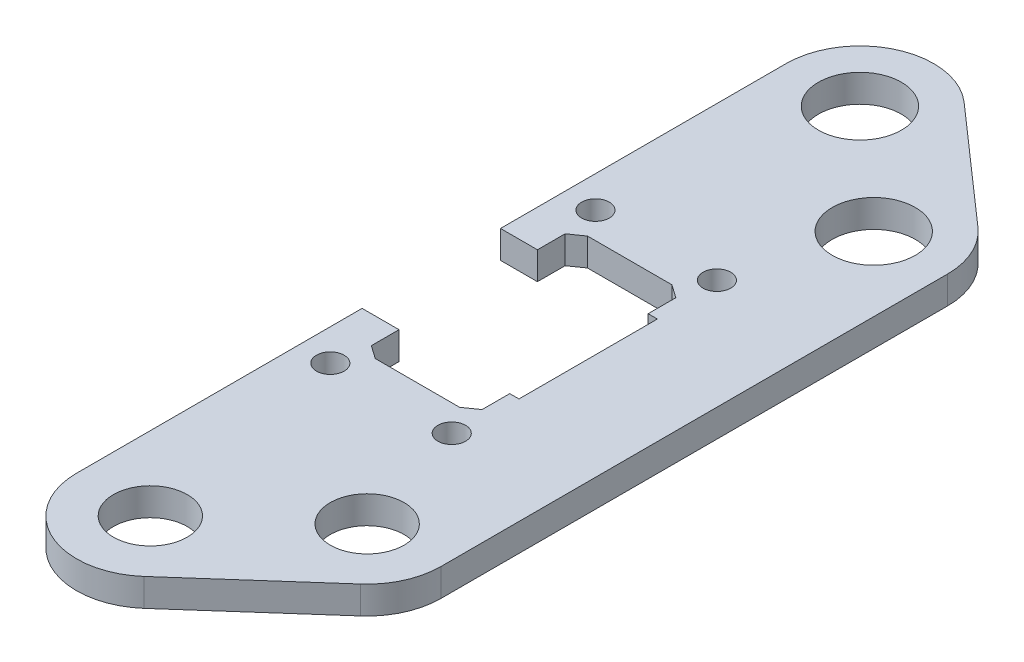
ISO-10303-21;
HEADER;
FILE_DESCRIPTION(('STEP AP214'),'2;1');
FILE_NAME('part.step','',(''),(''),'','','');
FILE_SCHEMA(('AUTOMOTIVE_DESIGN { 1 0 10303 214 1 1 1 1 }'));
ENDSEC;
DATA;
#1=APPLICATION_CONTEXT('core data for automotive mechanical design processes');
#2=APPLICATION_PROTOCOL_DEFINITION('international standard','automotive_design',2000,#1);
#3=PRODUCT_CONTEXT('',#1,'mechanical');
#4=PRODUCT('Part','Part','',(#3));
#5=PRODUCT_RELATED_PRODUCT_CATEGORY('part','',(#4));
#6=PRODUCT_DEFINITION_FORMATION('','',#4);
#7=PRODUCT_DEFINITION_CONTEXT('part definition',#1,'design');
#8=PRODUCT_DEFINITION('design','',#6,#7);
#9=PRODUCT_DEFINITION_SHAPE('','',#8);
#10=(LENGTH_UNIT() NAMED_UNIT(*) SI_UNIT(.MILLI.,.METRE.));
#11=(NAMED_UNIT(*) PLANE_ANGLE_UNIT() SI_UNIT($,.RADIAN.));
#12=(NAMED_UNIT(*) SI_UNIT($,.STERADIAN.) SOLID_ANGLE_UNIT());
#13=UNCERTAINTY_MEASURE_WITH_UNIT(LENGTH_MEASURE(1.E-05),#10,'distance_accuracy_value','');
#14=(GEOMETRIC_REPRESENTATION_CONTEXT(3) GLOBAL_UNCERTAINTY_ASSIGNED_CONTEXT((#13)) GLOBAL_UNIT_ASSIGNED_CONTEXT((#10,
#11,#12)) REPRESENTATION_CONTEXT('',''));
#15=CARTESIAN_POINT('',(0.,0.,0.));
#16=DIRECTION('',(0.,0.,1.));
#17=DIRECTION('',(1.,0.,0.));
#18=AXIS2_PLACEMENT_3D('',#15,#16,#17);
#19=CARTESIAN_POINT('',(-9.99999999999995,3.,0.));
#20=DIRECTION('',(-1.,0.,0.));
#21=DIRECTION('',(0.,0.,1.));
#22=AXIS2_PLACEMENT_3D('',#19,#20,#21);
#23=PLANE('',#22);
#24=DIRECTION('',(0.,0.,-1.));
#25=VECTOR('',#24,1.);
#26=CARTESIAN_POINT('',(-9.99999999999995,0.,0.));
#27=LINE('',#26,#25);
#28=CARTESIAN_POINT('',(-9.99999999999995,0.,38.4494228478842));
#29=VERTEX_POINT('',#28);
#30=CARTESIAN_POINT('',(-9.99999999999995,0.,7.49999999999991));
#31=VERTEX_POINT('',#30);
#32=EDGE_CURVE('E248',#29,#31,#27,.T.);
#33=ORIENTED_EDGE('',*,*,#32,.F.);
#34=DIRECTION('',(0.,-1.,0.));
#35=VECTOR('',#34,1.);
#36=CARTESIAN_POINT('',(-9.99999999999995,3.,38.4494228478842));
#37=LINE('',#36,#35);
#38=CARTESIAN_POINT('',(-9.99999999999995,3.,38.4494228478842));
#39=VERTEX_POINT('',#38);
#40=EDGE_CURVE('E11',#39,#29,#37,.T.);
#41=ORIENTED_EDGE('',*,*,#40,.F.);
#42=DIRECTION('',(0.,0.,-1.));
#43=VECTOR('',#42,1.);
#44=CARTESIAN_POINT('',(-9.99999999999995,3.,0.));
#45=LINE('',#44,#43);
#46=CARTESIAN_POINT('',(-9.99999999999995,3.,7.49999999999991));
#47=VERTEX_POINT('',#46);
#48=EDGE_CURVE('E380',#39,#47,#45,.T.);
#49=ORIENTED_EDGE('',*,*,#48,.T.);
#50=DIRECTION('',(0.,-1.,0.));
#51=VECTOR('',#50,1.);
#52=CARTESIAN_POINT('',(-9.99999999999995,3.,7.49999999999991));
#53=LINE('',#52,#51);
#54=EDGE_CURVE('E53',#47,#31,#53,.T.);
#55=ORIENTED_EDGE('',*,*,#54,.T.);
#56=EDGE_LOOP('',(#33,#41,#49,#55));
#57=FACE_BOUND('',#56,.T.);
#58=ADVANCED_FACE('F36',(#57),#23,.T.);
#59=CARTESIAN_POINT('',(-1.96890693060151,3.,38.4500022431788));
#60=DIRECTION('',(0.,-1.,0.));
#61=DIRECTION('',(0.,0.,-1.));
#62=AXIS2_PLACEMENT_3D('',#59,#60,#61);
#63=CYLINDRICAL_SURFACE('',#62,8.03109309033886);
#64=CARTESIAN_POINT('',(-1.96890693060151,0.,38.4500022431788));
#65=DIRECTION('',(0.,1.,0.));
#66=DIRECTION('',(0.,0.,1.));
#67=AXIS2_PLACEMENT_3D('',#64,#65,#66);
#68=CIRCLE('',#67,8.03109309033886);
#69=CARTESIAN_POINT('',(3.33665719137765,0.,44.4790523817915));
#70=VERTEX_POINT('',#69);
#71=EDGE_CURVE('E250',#29,#70,#68,.T.);
#72=ORIENTED_EDGE('',*,*,#71,.T.);
#73=DIRECTION('',(0.,-1.,0.));
#74=VECTOR('',#73,1.);
#75=CARTESIAN_POINT('',(3.33665719137765,3.,44.4790523817915));
#76=LINE('',#75,#74);
#77=CARTESIAN_POINT('',(3.33665719137765,3.,44.4790523817915));
#78=VERTEX_POINT('',#77);
#79=EDGE_CURVE('E45',#78,#70,#76,.T.);
#80=ORIENTED_EDGE('',*,*,#79,.F.);
#81=CARTESIAN_POINT('',(-1.96890693060151,3.,38.4500022431788));
#82=DIRECTION('',(0.,1.,0.));
#83=DIRECTION('',(0.,0.,1.));
#84=AXIS2_PLACEMENT_3D('',#81,#82,#83);
#85=CIRCLE('',#84,8.03109309033886);
#86=EDGE_CURVE('E378',#39,#78,#85,.T.);
#87=ORIENTED_EDGE('',*,*,#86,.F.);
#88=ORIENTED_EDGE('',*,*,#40,.T.);
#89=EDGE_LOOP('',(#72,#80,#87,#88));
#90=FACE_BOUND('',#89,.T.);
#91=ADVANCED_FACE('F365',(#90),#63,.T.);
#92=CARTESIAN_POINT('',(23.5426581772092,3.,26.5861974296433));
#93=DIRECTION('',(0.662954498755639,0.,0.748659690767213));
#94=DIRECTION('',(0.748659690767213,0.,-0.662954498755639));
#95=AXIS2_PLACEMENT_3D('',#92,#93,#94);
#96=PLANE('',#95);
#97=DIRECTION('',(-0.748659690767213,0.,0.662954498755639));
#98=VECTOR('',#97,1.);
#99=CARTESIAN_POINT('',(23.5426581772092,0.,26.5861974296433));
#100=LINE('',#99,#98);
#101=CARTESIAN_POINT('',(15.7967703221011,0.,33.4453502112471));
#102=VERTEX_POINT('',#101);
#103=EDGE_CURVE('E254',#102,#70,#100,.T.);
#104=ORIENTED_EDGE('',*,*,#103,.F.);
#105=DIRECTION('',(0.,-1.,0.));
#106=VECTOR('',#105,1.);
#107=CARTESIAN_POINT('',(15.7967703221011,3.,33.4453502112471));
#108=LINE('',#107,#106);
#109=CARTESIAN_POINT('',(15.7967703221011,3.,33.4453502112471));
#110=VERTEX_POINT('',#109);
#111=EDGE_CURVE('E355',#110,#102,#108,.T.);
#112=ORIENTED_EDGE('',*,*,#111,.F.);
#113=DIRECTION('',(-0.748659690767213,0.,0.662954498755639));
#114=VECTOR('',#113,1.);
#115=CARTESIAN_POINT('',(23.5426581772092,3.,26.5861974296433));
#116=LINE('',#115,#114);
#117=EDGE_CURVE('E362',#110,#78,#116,.T.);
#118=ORIENTED_EDGE('',*,*,#117,.T.);
#119=ORIENTED_EDGE('',*,*,#79,.T.);
#120=EDGE_LOOP('',(#104,#112,#118,#119));
#121=FACE_BOUND('',#120,.T.);
#122=ADVANCED_FACE('F360',(#121),#96,.T.);
#123=CARTESIAN_POINT('',(10.4999999999999,3.,27.4499999999999));
#124=DIRECTION('',(0.,-1.,0.));
#125=DIRECTION('',(0.,0.,-1.));
#126=AXIS2_PLACEMENT_3D('',#123,#124,#125);
#127=CYLINDRICAL_SURFACE('',#126,8.00000000003708);
#128=CARTESIAN_POINT('',(10.4999999999999,0.,27.4499999999999));
#129=DIRECTION('',(0.,1.,0.));
#130=DIRECTION('',(0.,0.,1.));
#131=AXIS2_PLACEMENT_3D('',#128,#129,#130);
#132=CIRCLE('',#131,8.00000000003708);
#133=CARTESIAN_POINT('',(18.5,0.,27.4500243145923));
#134=VERTEX_POINT('',#133);
#135=EDGE_CURVE('E257',#102,#134,#132,.T.);
#136=ORIENTED_EDGE('',*,*,#135,.T.);
#137=DIRECTION('',(0.,-1.,0.));
#138=VECTOR('',#137,1.);
#139=CARTESIAN_POINT('',(18.5,3.,27.4500243145923));
#140=LINE('',#139,#138);
#141=CARTESIAN_POINT('',(18.5,3.,27.4500243145923));
#142=VERTEX_POINT('',#141);
#143=EDGE_CURVE('E352',#142,#134,#140,.T.);
#144=ORIENTED_EDGE('',*,*,#143,.F.);
#145=CARTESIAN_POINT('',(10.4999999999999,3.,27.4499999999999));
#146=DIRECTION('',(0.,1.,0.));
#147=DIRECTION('',(0.,0.,1.));
#148=AXIS2_PLACEMENT_3D('',#145,#146,#147);
#149=CIRCLE('',#148,8.00000000003708);
#150=EDGE_CURVE('E375',#110,#142,#149,.T.);
#151=ORIENTED_EDGE('',*,*,#150,.F.);
#152=ORIENTED_EDGE('',*,*,#111,.T.);
#153=EDGE_LOOP('',(#136,#144,#151,#152));
#154=FACE_BOUND('',#153,.T.);
#155=ADVANCED_FACE('F372',(#154),#127,.T.);
#156=CARTESIAN_POINT('',(18.5,3.,0.));
#157=DIRECTION('',(-1.,0.,0.));
#158=DIRECTION('',(0.,0.,1.));
#159=AXIS2_PLACEMENT_3D('',#156,#157,#158);
#160=PLANE('',#159);
#161=DIRECTION('',(0.,0.,-1.));
#162=VECTOR('',#161,1.);
#163=CARTESIAN_POINT('',(18.5,0.,0.));
#164=LINE('',#163,#162);
#165=CARTESIAN_POINT('',(18.5,0.,-27.4500000000003));
#166=VERTEX_POINT('',#165);
#167=EDGE_CURVE('E260',#134,#166,#164,.T.);
#168=ORIENTED_EDGE('',*,*,#167,.T.);
#169=DIRECTION('',(0.,-1.,0.));
#170=VECTOR('',#169,1.);
#171=CARTESIAN_POINT('',(18.5,3.,-27.4500000000003));
#172=LINE('',#171,#170);
#173=CARTESIAN_POINT('',(18.5,3.,-27.4500000000003));
#174=VERTEX_POINT('',#173);
#175=EDGE_CURVE('E350',#174,#166,#172,.T.);
#176=ORIENTED_EDGE('',*,*,#175,.F.);
#177=DIRECTION('',(0.,0.,-1.));
#178=VECTOR('',#177,1.);
#179=CARTESIAN_POINT('',(18.5,3.,0.));
#180=LINE('',#179,#178);
#181=EDGE_CURVE('E376',#142,#174,#180,.T.);
#182=ORIENTED_EDGE('',*,*,#181,.F.);
#183=ORIENTED_EDGE('',*,*,#143,.T.);
#184=EDGE_LOOP('',(#168,#176,#182,#183));
#185=FACE_BOUND('',#184,.T.);
#186=ADVANCED_FACE('F609',(#185),#160,.F.);
#187=CARTESIAN_POINT('',(10.5,3.,-27.4500000000003));
#188=DIRECTION('',(0.,-1.,0.));
#189=DIRECTION('',(0.,0.,-1.));
#190=AXIS2_PLACEMENT_3D('',#187,#188,#189);
#191=CYLINDRICAL_SURFACE('',#190,8.00000000000001);
#192=CARTESIAN_POINT('',(10.5,0.,-27.4500000000003));
#193=DIRECTION('',(0.,1.,0.));
#194=DIRECTION('',(0.,0.,1.));
#195=AXIS2_PLACEMENT_3D('',#192,#193,#194);
#196=CIRCLE('',#195,8.00000000000001);
#197=CARTESIAN_POINT('',(15.7850231591364,0.,-33.4557081353822));
#198=VERTEX_POINT('',#197);
#199=EDGE_CURVE('E263',#198,#166,#196,.F.);
#200=ORIENTED_EDGE('',*,*,#199,.F.);
#201=DIRECTION('',(0.,-1.,0.));
#202=VECTOR('',#201,1.);
#203=CARTESIAN_POINT('',(15.7850231591364,3.,-33.4557081353822));
#204=LINE('',#203,#202);
#205=CARTESIAN_POINT('',(15.7850231591364,3.,-33.4557081353822));
#206=VERTEX_POINT('',#205);
#207=EDGE_CURVE('E348',#206,#198,#204,.T.);
#208=ORIENTED_EDGE('',*,*,#207,.F.);
#209=CARTESIAN_POINT('',(10.5,3.,-27.4500000000003));
#210=DIRECTION('',(0.,1.,0.));
#211=DIRECTION('',(0.,0.,1.));
#212=AXIS2_PLACEMENT_3D('',#209,#210,#211);
#213=CIRCLE('',#212,8.00000000000001);
#214=EDGE_CURVE('E385',#206,#174,#213,.F.);
#215=ORIENTED_EDGE('',*,*,#214,.T.);
#216=ORIENTED_EDGE('',*,*,#175,.T.);
#217=EDGE_LOOP('',(#200,#208,#215,#216));
#218=FACE_BOUND('',#217,.T.);
#219=ADVANCED_FACE('F616',(#218),#191,.T.);
#220=CARTESIAN_POINT('',(23.4811457921391,3.,-26.6831202183396));
#221=DIRECTION('',(-0.660627894892029,0.,0.750713516922752));
#222=DIRECTION('',(0.750713516922752,0.,0.660627894892029));
#223=AXIS2_PLACEMENT_3D('',#220,#221,#222);
#224=PLANE('',#223);
#225=DIRECTION('',(-0.750713516922752,0.,-0.660627894892029));
#226=VECTOR('',#225,1.);
#227=CARTESIAN_POINT('',(23.4811457921391,0.,-26.6831202183396));
#228=LINE('',#227,#226);
#229=CARTESIAN_POINT('',(3.28502315913642,0.,-44.4557081353822));
#230=VERTEX_POINT('',#229);
#231=EDGE_CURVE('E266',#198,#230,#228,.T.);
#232=ORIENTED_EDGE('',*,*,#231,.T.);
#233=DIRECTION('',(0.,-1.,0.));
#234=VECTOR('',#233,1.);
#235=CARTESIAN_POINT('',(3.28502315913642,3.,-44.4557081353822));
#236=LINE('',#235,#234);
#237=CARTESIAN_POINT('',(3.28502315913642,3.,-44.4557081353822));
#238=VERTEX_POINT('',#237);
#239=EDGE_CURVE('E346',#238,#230,#236,.T.);
#240=ORIENTED_EDGE('',*,*,#239,.F.);
#241=DIRECTION('',(-0.750713516922752,0.,-0.660627894892029));
#242=VECTOR('',#241,1.);
#243=CARTESIAN_POINT('',(23.4811457921391,3.,-26.6831202183396));
#244=LINE('',#243,#242);
#245=EDGE_CURVE('E388',#206,#238,#244,.T.);
#246=ORIENTED_EDGE('',*,*,#245,.F.);
#247=ORIENTED_EDGE('',*,*,#207,.T.);
#248=EDGE_LOOP('',(#232,#240,#246,#247));
#249=FACE_BOUND('',#248,.T.);
#250=ADVANCED_FACE('F462',(#249),#224,.F.);
#251=CARTESIAN_POINT('',(-1.99999999999986,3.,-38.4500000000001));
#252=DIRECTION('',(0.,-1.,0.));
#253=DIRECTION('',(0.,0.,-1.));
#254=AXIS2_PLACEMENT_3D('',#251,#252,#253);
#255=CYLINDRICAL_SURFACE('',#254,8.00000000000011);
#256=CARTESIAN_POINT('',(-1.99999999999986,0.,-38.4500000000001));
#257=DIRECTION('',(0.,1.,0.));
#258=DIRECTION('',(0.,0.,1.));
#259=AXIS2_PLACEMENT_3D('',#256,#257,#258);
#260=CIRCLE('',#259,8.00000000000011);
#261=CARTESIAN_POINT('',(-9.99999999999995,0.,-38.4500000000001));
#262=VERTEX_POINT('',#261);
#263=EDGE_CURVE('E269',#262,#230,#260,.F.);
#264=ORIENTED_EDGE('',*,*,#263,.F.);
#265=DIRECTION('',(0.,-1.,0.));
#266=VECTOR('',#265,1.);
#267=CARTESIAN_POINT('',(-9.99999999999995,3.,-38.4500000000001));
#268=LINE('',#267,#266);
#269=CARTESIAN_POINT('',(-9.99999999999995,3.,-38.4500000000001));
#270=VERTEX_POINT('',#269);
#271=EDGE_CURVE('E344',#270,#262,#268,.T.);
#272=ORIENTED_EDGE('',*,*,#271,.F.);
#273=CARTESIAN_POINT('',(-1.99999999999986,3.,-38.4500000000001));
#274=DIRECTION('',(0.,1.,0.));
#275=DIRECTION('',(0.,0.,1.));
#276=AXIS2_PLACEMENT_3D('',#273,#274,#275);
#277=CIRCLE('',#276,8.00000000000011);
#278=EDGE_CURVE('E390',#270,#238,#277,.F.);
#279=ORIENTED_EDGE('',*,*,#278,.T.);
#280=ORIENTED_EDGE('',*,*,#239,.T.);
#281=EDGE_LOOP('',(#264,#272,#279,#280));
#282=FACE_BOUND('',#281,.T.);
#283=ADVANCED_FACE('F454',(#282),#255,.T.);
#284=CARTESIAN_POINT('',(-9.99999999999995,0.,-7.50000000000009));
#285=VERTEX_POINT('',#284);
#286=EDGE_CURVE('E251',#285,#262,#27,.T.);
#287=ORIENTED_EDGE('',*,*,#286,.F.);
#288=DIRECTION('',(0.,-1.,0.));
#289=VECTOR('',#288,1.);
#290=CARTESIAN_POINT('',(-9.99999999999995,3.,-7.50000000000009));
#291=LINE('',#290,#289);
#292=CARTESIAN_POINT('',(-9.99999999999995,3.,-7.50000000000009));
#293=VERTEX_POINT('',#292);
#294=EDGE_CURVE('E342',#293,#285,#291,.T.);
#295=ORIENTED_EDGE('',*,*,#294,.F.);
#296=EDGE_CURVE('E393',#293,#270,#45,.T.);
#297=ORIENTED_EDGE('',*,*,#296,.T.);
#298=ORIENTED_EDGE('',*,*,#271,.T.);
#299=EDGE_LOOP('',(#287,#295,#297,#298));
#300=FACE_BOUND('',#299,.T.);
#301=ADVANCED_FACE('F445',(#300),#23,.T.);
#302=CARTESIAN_POINT('',(0.,3.,-7.50000000000008));
#303=DIRECTION('',(0.,0.,-1.));
#304=DIRECTION('',(-1.,0.,0.));
#305=AXIS2_PLACEMENT_3D('',#302,#303,#304);
#306=PLANE('',#305);
#307=DIRECTION('',(1.,0.,0.));
#308=VECTOR('',#307,1.);
#309=CARTESIAN_POINT('',(0.,0.,-7.50000000000008));
#310=LINE('',#309,#308);
#311=CARTESIAN_POINT('',(-6.00000000000002,0.,-7.50000000000009));
#312=VERTEX_POINT('',#311);
#313=EDGE_CURVE('E272',#285,#312,#310,.T.);
#314=ORIENTED_EDGE('',*,*,#313,.T.);
#315=DIRECTION('',(0.,-1.,0.));
#316=VECTOR('',#315,1.);
#317=CARTESIAN_POINT('',(-6.00000000000002,3.,-7.50000000000009));
#318=LINE('',#317,#316);
#319=CARTESIAN_POINT('',(-6.00000000000002,3.,-7.50000000000009));
#320=VERTEX_POINT('',#319);
#321=EDGE_CURVE('E340',#320,#312,#318,.T.);
#322=ORIENTED_EDGE('',*,*,#321,.F.);
#323=DIRECTION('',(1.,0.,0.));
#324=VECTOR('',#323,1.);
#325=CARTESIAN_POINT('',(0.,3.,-7.50000000000008));
#326=LINE('',#325,#324);
#327=EDGE_CURVE('E394',#293,#320,#326,.T.);
#328=ORIENTED_EDGE('',*,*,#327,.F.);
#329=ORIENTED_EDGE('',*,*,#294,.T.);
#330=EDGE_LOOP('',(#314,#322,#328,#329));
#331=FACE_BOUND('',#330,.T.);
#332=ADVANCED_FACE('F453',(#331),#306,.F.);
#333=CARTESIAN_POINT('',(-5.99999999999996,3.,0.));
#334=DIRECTION('',(1.,0.,0.));
#335=DIRECTION('',(0.,0.,-1.));
#336=AXIS2_PLACEMENT_3D('',#333,#334,#335);
#337=PLANE('',#336);
#338=DIRECTION('',(0.,0.,1.));
#339=VECTOR('',#338,1.);
#340=CARTESIAN_POINT('',(-5.99999999999996,0.,0.));
#341=LINE('',#340,#339);
#342=CARTESIAN_POINT('',(-6.00000000000005,0.,-10.5));
#343=VERTEX_POINT('',#342);
#344=EDGE_CURVE('E275',#343,#312,#341,.T.);
#345=ORIENTED_EDGE('',*,*,#344,.F.);
#346=DIRECTION('',(0.,-1.,0.));
#347=VECTOR('',#346,1.);
#348=CARTESIAN_POINT('',(-6.00000000000005,3.,-10.5));
#349=LINE('',#348,#347);
#350=CARTESIAN_POINT('',(-6.00000000000005,3.,-10.5));
#351=VERTEX_POINT('',#350);
#352=EDGE_CURVE('E338',#351,#343,#349,.T.);
#353=ORIENTED_EDGE('',*,*,#352,.F.);
#354=DIRECTION('',(0.,0.,1.));
#355=VECTOR('',#354,1.);
#356=CARTESIAN_POINT('',(-5.99999999999996,3.,0.));
#357=LINE('',#356,#355);
#358=EDGE_CURVE('E396',#351,#320,#357,.T.);
#359=ORIENTED_EDGE('',*,*,#358,.T.);
#360=ORIENTED_EDGE('',*,*,#321,.T.);
#361=EDGE_LOOP('',(#345,#353,#359,#360));
#362=FACE_BOUND('',#361,.T.);
#363=ADVANCED_FACE('F460',(#362),#337,.T.);
#364=CARTESIAN_POINT('',(-6.90732582914878,3.,-9.86468361481774));
#365=DIRECTION('',(-0.573576436351023,0.,-0.819152044289008));
#366=DIRECTION('',(-0.819152044289008,0.,0.573576436351023));
#367=AXIS2_PLACEMENT_3D('',#364,#365,#366);
#368=PLANE('',#367);
#369=DIRECTION('',(0.819152044289008,0.,-0.573576436351023));
#370=VECTOR('',#369,1.);
#371=CARTESIAN_POINT('',(-6.90732582914878,0.,-9.86468361481774));
#372=LINE('',#371,#370);
#373=CARTESIAN_POINT('',(-4.5718519932576,0.,-11.5000000000002));
#374=VERTEX_POINT('',#373);
#375=EDGE_CURVE('E278',#343,#374,#372,.T.);
#376=ORIENTED_EDGE('',*,*,#375,.T.);
#377=DIRECTION('',(0.,-1.,0.));
#378=VECTOR('',#377,1.);
#379=CARTESIAN_POINT('',(-4.5718519932576,3.,-11.5000000000002));
#380=LINE('',#379,#378);
#381=CARTESIAN_POINT('',(-4.5718519932576,3.,-11.5000000000002));
#382=VERTEX_POINT('',#381);
#383=EDGE_CURVE('E335',#382,#374,#380,.T.);
#384=ORIENTED_EDGE('',*,*,#383,.F.);
#385=DIRECTION('',(0.819152044289008,0.,-0.573576436351023));
#386=VECTOR('',#385,1.);
#387=CARTESIAN_POINT('',(-6.90732582914878,3.,-9.86468361481774));
#388=LINE('',#387,#386);
#389=EDGE_CURVE('E399',#351,#382,#388,.T.);
#390=ORIENTED_EDGE('',*,*,#389,.F.);
#391=ORIENTED_EDGE('',*,*,#352,.T.);
#392=EDGE_LOOP('',(#376,#384,#390,#391));
#393=FACE_BOUND('',#392,.T.);
#394=ADVANCED_FACE('F648',(#393),#368,.F.);
#395=CARTESIAN_POINT('',(0.,3.,-11.5000000000002));
#396=DIRECTION('',(0.,0.,-1.));
#397=DIRECTION('',(-1.,0.,0.));
#398=AXIS2_PLACEMENT_3D('',#395,#396,#397);
#399=PLANE('',#398);
#400=DIRECTION('',(1.,0.,0.));
#401=VECTOR('',#400,1.);
#402=CARTESIAN_POINT('',(0.,0.,-11.5000000000002));
#403=LINE('',#402,#401);
#404=CARTESIAN_POINT('',(4.57185199325762,0.,-11.5000000000002));
#405=VERTEX_POINT('',#404);
#406=EDGE_CURVE('E281',#374,#405,#403,.T.);
#407=ORIENTED_EDGE('',*,*,#406,.T.);
#408=DIRECTION('',(0.,-1.,0.));
#409=VECTOR('',#408,1.);
#410=CARTESIAN_POINT('',(4.57185199325762,3.,-11.5000000000002));
#411=LINE('',#410,#409);
#412=CARTESIAN_POINT('',(4.57185199325762,3.,-11.5000000000002));
#413=VERTEX_POINT('',#412);
#414=EDGE_CURVE('E333',#413,#405,#411,.T.);
#415=ORIENTED_EDGE('',*,*,#414,.F.);
#416=DIRECTION('',(1.,0.,0.));
#417=VECTOR('',#416,1.);
#418=CARTESIAN_POINT('',(0.,3.,-11.5000000000002));
#419=LINE('',#418,#417);
#420=EDGE_CURVE('E402',#382,#413,#419,.T.);
#421=ORIENTED_EDGE('',*,*,#420,.F.);
#422=ORIENTED_EDGE('',*,*,#383,.T.);
#423=EDGE_LOOP('',(#407,#415,#421,#422));
#424=FACE_BOUND('',#423,.T.);
#425=ADVANCED_FACE('F656',(#424),#399,.F.);
#426=CARTESIAN_POINT('',(6.90732582914897,3.,-9.86468361481755));
#427=DIRECTION('',(-0.573576436351041,0.,0.819152044288995));
#428=DIRECTION('',(0.819152044288995,0.,0.573576436351041));
#429=AXIS2_PLACEMENT_3D('',#426,#427,#428);
#430=PLANE('',#429);
#431=DIRECTION('',(-0.819152044288995,0.,-0.573576436351041));
#432=VECTOR('',#431,1.);
#433=CARTESIAN_POINT('',(6.90732582914897,0.,-9.86468361481755));
#434=LINE('',#433,#432);
#435=CARTESIAN_POINT('',(6.,0.,-10.5));
#436=VERTEX_POINT('',#435);
#437=EDGE_CURVE('E284',#436,#405,#434,.T.);
#438=ORIENTED_EDGE('',*,*,#437,.F.);
#439=DIRECTION('',(0.,-1.,0.));
#440=VECTOR('',#439,1.);
#441=CARTESIAN_POINT('',(6.,3.,-10.5));
#442=LINE('',#441,#440);
#443=CARTESIAN_POINT('',(6.,3.,-10.5));
#444=VERTEX_POINT('',#443);
#445=EDGE_CURVE('E331',#444,#436,#442,.T.);
#446=ORIENTED_EDGE('',*,*,#445,.F.);
#447=DIRECTION('',(-0.819152044288995,0.,-0.573576436351041));
#448=VECTOR('',#447,1.);
#449=CARTESIAN_POINT('',(6.90732582914897,3.,-9.86468361481755));
#450=LINE('',#449,#448);
#451=EDGE_CURVE('E404',#444,#413,#450,.T.);
#452=ORIENTED_EDGE('',*,*,#451,.T.);
#453=ORIENTED_EDGE('',*,*,#414,.T.);
#454=EDGE_LOOP('',(#438,#446,#452,#453));
#455=FACE_BOUND('',#454,.T.);
#456=ADVANCED_FACE('F664',(#455),#430,.T.);
#457=CARTESIAN_POINT('',(6.,3.,0.));
#458=DIRECTION('',(1.,0.,0.));
#459=DIRECTION('',(0.,0.,-1.));
#460=AXIS2_PLACEMENT_3D('',#457,#458,#459);
#461=PLANE('',#460);
#462=DIRECTION('',(0.,0.,1.));
#463=VECTOR('',#462,1.);
#464=CARTESIAN_POINT('',(6.,0.,0.));
#465=LINE('',#464,#463);
#466=CARTESIAN_POINT('',(6.,0.,-7.50000000000009));
#467=VERTEX_POINT('',#466);
#468=EDGE_CURVE('E287',#436,#467,#465,.T.);
#469=ORIENTED_EDGE('',*,*,#468,.T.);
#470=DIRECTION('',(0.,-1.,0.));
#471=VECTOR('',#470,1.);
#472=CARTESIAN_POINT('',(6.,3.,-7.50000000000009));
#473=LINE('',#472,#471);
#474=CARTESIAN_POINT('',(6.,3.,-7.50000000000009));
#475=VERTEX_POINT('',#474);
#476=EDGE_CURVE('E328',#475,#467,#473,.T.);
#477=ORIENTED_EDGE('',*,*,#476,.F.);
#478=DIRECTION('',(0.,0.,1.));
#479=VECTOR('',#478,1.);
#480=CARTESIAN_POINT('',(6.,3.,0.));
#481=LINE('',#480,#479);
#482=EDGE_CURVE('E407',#444,#475,#481,.T.);
#483=ORIENTED_EDGE('',*,*,#482,.F.);
#484=ORIENTED_EDGE('',*,*,#445,.T.);
#485=EDGE_LOOP('',(#469,#477,#483,#484));
#486=FACE_BOUND('',#485,.T.);
#487=ADVANCED_FACE('F672',(#486),#461,.F.);
#488=CARTESIAN_POINT('',(0.,3.,-7.50000000000009));
#489=DIRECTION('',(0.,0.,-1.));
#490=DIRECTION('',(-1.,0.,0.));
#491=AXIS2_PLACEMENT_3D('',#488,#489,#490);
#492=PLANE('',#491);
#493=DIRECTION('',(1.,0.,0.));
#494=VECTOR('',#493,1.);
#495=CARTESIAN_POINT('',(0.,0.,-7.50000000000009));
#496=LINE('',#495,#494);
#497=CARTESIAN_POINT('',(6.99999999999995,0.,-7.50000000000009));
#498=VERTEX_POINT('',#497);
#499=EDGE_CURVE('E290',#467,#498,#496,.T.);
#500=ORIENTED_EDGE('',*,*,#499,.T.);
#501=DIRECTION('',(0.,-1.,0.));
#502=VECTOR('',#501,1.);
#503=CARTESIAN_POINT('',(6.99999999999995,3.,-7.50000000000009));
#504=LINE('',#503,#502);
#505=CARTESIAN_POINT('',(6.99999999999995,3.,-7.50000000000009));
#506=VERTEX_POINT('',#505);
#507=EDGE_CURVE('E326',#506,#498,#504,.T.);
#508=ORIENTED_EDGE('',*,*,#507,.F.);
#509=DIRECTION('',(1.,0.,0.));
#510=VECTOR('',#509,1.);
#511=CARTESIAN_POINT('',(0.,3.,-7.50000000000009));
#512=LINE('',#511,#510);
#513=EDGE_CURVE('E410',#475,#506,#512,.T.);
#514=ORIENTED_EDGE('',*,*,#513,.F.);
#515=ORIENTED_EDGE('',*,*,#476,.T.);
#516=EDGE_LOOP('',(#500,#508,#514,#515));
#517=FACE_BOUND('',#516,.T.);
#518=ADVANCED_FACE('F680',(#517),#492,.F.);
#519=CARTESIAN_POINT('',(6.99999999999995,3.,0.));
#520=DIRECTION('',(-1.,0.,0.));
#521=DIRECTION('',(0.,0.,1.));
#522=AXIS2_PLACEMENT_3D('',#519,#520,#521);
#523=PLANE('',#522);
#524=DIRECTION('',(0.,0.,-1.));
#525=VECTOR('',#524,1.);
#526=CARTESIAN_POINT('',(6.99999999999995,0.,0.));
#527=LINE('',#526,#525);
#528=CARTESIAN_POINT('',(6.99999999999995,0.,7.49999999999991));
#529=VERTEX_POINT('',#528);
#530=EDGE_CURVE('E293',#529,#498,#527,.T.);
#531=ORIENTED_EDGE('',*,*,#530,.F.);
#532=DIRECTION('',(0.,-1.,0.));
#533=VECTOR('',#532,1.);
#534=CARTESIAN_POINT('',(6.99999999999995,3.,7.49999999999991));
#535=LINE('',#534,#533);
#536=CARTESIAN_POINT('',(6.99999999999995,3.,7.49999999999991));
#537=VERTEX_POINT('',#536);
#538=EDGE_CURVE('E324',#537,#529,#535,.T.);
#539=ORIENTED_EDGE('',*,*,#538,.F.);
#540=DIRECTION('',(0.,0.,-1.));
#541=VECTOR('',#540,1.);
#542=CARTESIAN_POINT('',(6.99999999999995,3.,0.));
#543=LINE('',#542,#541);
#544=EDGE_CURVE('E412',#537,#506,#543,.T.);
#545=ORIENTED_EDGE('',*,*,#544,.T.);
#546=ORIENTED_EDGE('',*,*,#507,.T.);
#547=EDGE_LOOP('',(#531,#539,#545,#546));
#548=FACE_BOUND('',#547,.T.);
#549=ADVANCED_FACE('F688',(#548),#523,.T.);
#550=CARTESIAN_POINT('',(0.,3.,7.49999999999991));
#551=DIRECTION('',(0.,0.,-1.));
#552=DIRECTION('',(-1.,0.,0.));
#553=AXIS2_PLACEMENT_3D('',#550,#551,#552);
#554=PLANE('',#553);
#555=DIRECTION('',(1.,0.,0.));
#556=VECTOR('',#555,1.);
#557=CARTESIAN_POINT('',(0.,0.,7.49999999999991));
#558=LINE('',#557,#556);
#559=CARTESIAN_POINT('',(6.,0.,7.49999999999991));
#560=VERTEX_POINT('',#559);
#561=EDGE_CURVE('E296',#560,#529,#558,.T.);
#562=ORIENTED_EDGE('',*,*,#561,.F.);
#563=DIRECTION('',(0.,-1.,0.));
#564=VECTOR('',#563,1.);
#565=CARTESIAN_POINT('',(6.,3.,7.49999999999991));
#566=LINE('',#565,#564);
#567=CARTESIAN_POINT('',(6.,3.,7.49999999999991));
#568=VERTEX_POINT('',#567);
#569=EDGE_CURVE('E322',#568,#560,#566,.T.);
#570=ORIENTED_EDGE('',*,*,#569,.F.);
#571=DIRECTION('',(1.,0.,0.));
#572=VECTOR('',#571,1.);
#573=CARTESIAN_POINT('',(0.,3.,7.49999999999991));
#574=LINE('',#573,#572);
#575=EDGE_CURVE('E415',#568,#537,#574,.T.);
#576=ORIENTED_EDGE('',*,*,#575,.T.);
#577=ORIENTED_EDGE('',*,*,#538,.T.);
#578=EDGE_LOOP('',(#562,#570,#576,#577));
#579=FACE_BOUND('',#578,.T.);
#580=ADVANCED_FACE('F696',(#579),#554,.T.);
#581=CARTESIAN_POINT('',(6.,3.,0.));
#582=DIRECTION('',(-1.,0.,0.));
#583=DIRECTION('',(0.,0.,1.));
#584=AXIS2_PLACEMENT_3D('',#581,#582,#583);
#585=PLANE('',#584);
#586=DIRECTION('',(0.,0.,-1.));
#587=VECTOR('',#586,1.);
#588=CARTESIAN_POINT('',(6.,0.,0.));
#589=LINE('',#588,#587);
#590=CARTESIAN_POINT('',(6.,0.,10.4999999999998));
#591=VERTEX_POINT('',#590);
#592=EDGE_CURVE('E299',#591,#560,#589,.T.);
#593=ORIENTED_EDGE('',*,*,#592,.F.);
#594=DIRECTION('',(0.,-1.,0.));
#595=VECTOR('',#594,1.);
#596=CARTESIAN_POINT('',(6.,3.,10.4999999999998));
#597=LINE('',#596,#595);
#598=CARTESIAN_POINT('',(6.,3.,10.4999999999998));
#599=VERTEX_POINT('',#598);
#600=EDGE_CURVE('E320',#599,#591,#597,.T.);
#601=ORIENTED_EDGE('',*,*,#600,.F.);
#602=DIRECTION('',(0.,0.,-1.));
#603=VECTOR('',#602,1.);
#604=CARTESIAN_POINT('',(6.,3.,0.));
#605=LINE('',#604,#603);
#606=EDGE_CURVE('E418',#599,#568,#605,.T.);
#607=ORIENTED_EDGE('',*,*,#606,.T.);
#608=ORIENTED_EDGE('',*,*,#569,.T.);
#609=EDGE_LOOP('',(#593,#601,#607,#608));
#610=FACE_BOUND('',#609,.T.);
#611=ADVANCED_FACE('F704',(#610),#585,.T.);
#612=CARTESIAN_POINT('',(6.90732582914889,3.,9.86468361481743));
#613=DIRECTION('',(0.573576436351041,0.,0.819152044288995));
#614=DIRECTION('',(0.819152044288995,0.,-0.573576436351042));
#615=AXIS2_PLACEMENT_3D('',#612,#613,#614);
#616=PLANE('',#615);
#617=DIRECTION('',(-0.819152044288995,0.,0.573576436351041));
#618=VECTOR('',#617,1.);
#619=CARTESIAN_POINT('',(6.90732582914889,0.,9.86468361481743));
#620=LINE('',#619,#618);
#621=CARTESIAN_POINT('',(4.5718519932578,0.,11.4999999999999));
#622=VERTEX_POINT('',#621);
#623=EDGE_CURVE('E302',#591,#622,#620,.T.);
#624=ORIENTED_EDGE('',*,*,#623,.T.);
#625=DIRECTION('',(0.,-1.,0.));
#626=VECTOR('',#625,1.);
#627=CARTESIAN_POINT('',(4.5718519932578,3.,11.4999999999999));
#628=LINE('',#627,#626);
#629=CARTESIAN_POINT('',(4.5718519932578,3.,11.4999999999999));
#630=VERTEX_POINT('',#629);
#631=EDGE_CURVE('E318',#630,#622,#628,.T.);
#632=ORIENTED_EDGE('',*,*,#631,.F.);
#633=DIRECTION('',(-0.819152044288995,0.,0.573576436351041));
#634=VECTOR('',#633,1.);
#635=CARTESIAN_POINT('',(6.90732582914889,3.,9.86468361481743));
#636=LINE('',#635,#634);
#637=EDGE_CURVE('E224',#599,#630,#636,.T.);
#638=ORIENTED_EDGE('',*,*,#637,.F.);
#639=ORIENTED_EDGE('',*,*,#600,.T.);
#640=EDGE_LOOP('',(#624,#632,#638,#639));
#641=FACE_BOUND('',#640,.T.);
#642=ADVANCED_FACE('F425',(#641),#616,.F.);
#643=CARTESIAN_POINT('',(0.,3.,11.4999999999999));
#644=DIRECTION('',(0.,0.,-1.));
#645=DIRECTION('',(-1.,0.,0.));
#646=AXIS2_PLACEMENT_3D('',#643,#644,#645);
#647=PLANE('',#646);
#648=DIRECTION('',(1.,0.,0.));
#649=VECTOR('',#648,1.);
#650=CARTESIAN_POINT('',(0.,0.,11.4999999999999));
#651=LINE('',#650,#649);
#652=CARTESIAN_POINT('',(-4.57185199325793,0.,11.4999999999999));
#653=VERTEX_POINT('',#652);
#654=EDGE_CURVE('E305',#653,#622,#651,.T.);
#655=ORIENTED_EDGE('',*,*,#654,.F.);
#656=DIRECTION('',(0.,-1.,0.));
#657=VECTOR('',#656,1.);
#658=CARTESIAN_POINT('',(-4.57185199325793,3.,11.4999999999999));
#659=LINE('',#658,#657);
#660=CARTESIAN_POINT('',(-4.57185199325793,3.,11.4999999999999));
#661=VERTEX_POINT('',#660);
#662=EDGE_CURVE('E209',#661,#653,#659,.T.);
#663=ORIENTED_EDGE('',*,*,#662,.F.);
#664=DIRECTION('',(1.,0.,0.));
#665=VECTOR('',#664,1.);
#666=CARTESIAN_POINT('',(0.,3.,11.4999999999999));
#667=LINE('',#666,#665);
#668=EDGE_CURVE('E222',#661,#630,#667,.T.);
#669=ORIENTED_EDGE('',*,*,#668,.T.);
#670=ORIENTED_EDGE('',*,*,#631,.T.);
#671=EDGE_LOOP('',(#655,#663,#669,#670));
#672=FACE_BOUND('',#671,.T.);
#673=ADVANCED_FACE('F429',(#672),#647,.T.);
#674=CARTESIAN_POINT('',(-6.90732582914896,3.,9.8646836148174));
#675=DIRECTION('',(0.573576436351047,0.,-0.819152044288991));
#676=DIRECTION('',(-0.819152044288991,0.,-0.573576436351047));
#677=AXIS2_PLACEMENT_3D('',#674,#675,#676);
#678=PLANE('',#677);
#679=DIRECTION('',(0.819152044288991,0.,0.573576436351047));
#680=VECTOR('',#679,1.);
#681=CARTESIAN_POINT('',(-6.90732582914896,0.,9.8646836148174));
#682=LINE('',#681,#680);
#683=CARTESIAN_POINT('',(-6.00000000000005,0.,10.4999999999998));
#684=VERTEX_POINT('',#683);
#685=EDGE_CURVE('E206',#684,#653,#682,.T.);
#686=ORIENTED_EDGE('',*,*,#685,.F.);
#687=DIRECTION('',(0.,-1.,0.));
#688=VECTOR('',#687,1.);
#689=CARTESIAN_POINT('',(-6.00000000000005,3.,10.4999999999998));
#690=LINE('',#689,#688);
#691=CARTESIAN_POINT('',(-6.00000000000005,3.,10.4999999999998));
#692=VERTEX_POINT('',#691);
#693=EDGE_CURVE('E200',#692,#684,#690,.T.);
#694=ORIENTED_EDGE('',*,*,#693,.F.);
#695=DIRECTION('',(0.819152044288991,0.,0.573576436351047));
#696=VECTOR('',#695,1.);
#697=CARTESIAN_POINT('',(-6.90732582914896,3.,9.8646836148174));
#698=LINE('',#697,#696);
#699=EDGE_CURVE('E204',#692,#661,#698,.T.);
#700=ORIENTED_EDGE('',*,*,#699,.T.);
#701=ORIENTED_EDGE('',*,*,#662,.T.);
#702=EDGE_LOOP('',(#686,#694,#700,#701));
#703=FACE_BOUND('',#702,.T.);
#704=ADVANCED_FACE('F202',(#703),#678,.T.);
#705=CARTESIAN_POINT('',(-5.99999999999996,3.,0.));
#706=DIRECTION('',(-1.,0.,0.));
#707=DIRECTION('',(0.,0.,1.));
#708=AXIS2_PLACEMENT_3D('',#705,#706,#707);
#709=PLANE('',#708);
#710=DIRECTION('',(0.,0.,-1.));
#711=VECTOR('',#710,1.);
#712=CARTESIAN_POINT('',(-5.99999999999996,0.,0.));
#713=LINE('',#712,#711);
#714=CARTESIAN_POINT('',(-6.00000000000002,0.,7.49999999999991));
#715=VERTEX_POINT('',#714);
#716=EDGE_CURVE('E309',#684,#715,#713,.T.);
#717=ORIENTED_EDGE('',*,*,#716,.T.);
#718=DIRECTION('',(0.,-1.,0.));
#719=VECTOR('',#718,1.);
#720=CARTESIAN_POINT('',(-6.00000000000002,3.,7.49999999999991));
#721=LINE('',#720,#719);
#722=CARTESIAN_POINT('',(-6.00000000000002,3.,7.49999999999991));
#723=VERTEX_POINT('',#722);
#724=EDGE_CURVE('E127',#723,#715,#721,.T.);
#725=ORIENTED_EDGE('',*,*,#724,.F.);
#726=DIRECTION('',(0.,0.,-1.));
#727=VECTOR('',#726,1.);
#728=CARTESIAN_POINT('',(-5.99999999999996,3.,0.));
#729=LINE('',#728,#727);
#730=EDGE_CURVE('E211',#692,#723,#729,.T.);
#731=ORIENTED_EDGE('',*,*,#730,.F.);
#732=ORIENTED_EDGE('',*,*,#693,.T.);
#733=EDGE_LOOP('',(#717,#725,#731,#732));
#734=FACE_BOUND('',#733,.T.);
#735=ADVANCED_FACE('F212',(#734),#709,.F.);
#736=CARTESIAN_POINT('',(10.4999999999999,3.,-27.4500000000001));
#737=DIRECTION('',(0.,-1.,0.));
#738=DIRECTION('',(0.,0.,-1.));
#739=AXIS2_PLACEMENT_3D('',#736,#737,#738);
#740=CYLINDRICAL_SURFACE('',#739,4.50000000000002);
#741=CARTESIAN_POINT('',(10.4999999999999,3.,-27.4500000000001));
#742=DIRECTION('',(0.,1.,0.));
#743=DIRECTION('',(0.,0.,1.));
#744=AXIS2_PLACEMENT_3D('',#741,#742,#743);
#745=CIRCLE('',#744,4.50000000000002);
#746=CARTESIAN_POINT('',(10.4999999999999,3.,-22.9500000000001));
#747=VERTEX_POINT('',#746);
#748=EDGE_CURVE('E478',#747,#747,#745,.F.);
#749=ORIENTED_EDGE('',*,*,#748,.F.);
#750=EDGE_LOOP('',(#749));
#751=FACE_BOUND('',#750,.T.);
#752=CARTESIAN_POINT('',(10.4999999999999,0.,-27.4500000000001));
#753=DIRECTION('',(0.,1.,0.));
#754=DIRECTION('',(0.,0.,1.));
#755=AXIS2_PLACEMENT_3D('',#752,#753,#754);
#756=CIRCLE('',#755,4.50000000000002);
#757=CARTESIAN_POINT('',(10.4999999999999,0.,-22.9500000000001));
#758=VERTEX_POINT('',#757);
#759=EDGE_CURVE('E245',#758,#758,#756,.F.);
#760=ORIENTED_EDGE('',*,*,#759,.T.);
#761=EDGE_LOOP('',(#760));
#762=FACE_BOUND('',#761,.T.);
#763=ADVANCED_FACE('F536',(#751,#762),#740,.F.);
#764=CARTESIAN_POINT('',(-6.57936952048645,3.,-14.3670321550115));
#765=DIRECTION('',(0.,-1.,0.));
#766=DIRECTION('',(0.,0.,-1.));
#767=AXIS2_PLACEMENT_3D('',#764,#765,#766);
#768=CYLINDRICAL_SURFACE('',#767,1.5);
#769=CARTESIAN_POINT('',(-6.57936952048645,3.,-14.3670321550115));
#770=DIRECTION('',(0.,1.,0.));
#771=DIRECTION('',(0.,0.,1.));
#772=AXIS2_PLACEMENT_3D('',#769,#770,#771);
#773=CIRCLE('',#772,1.5);
#774=CARTESIAN_POINT('',(-6.57936952048645,3.,-12.8670321550115));
#775=VERTEX_POINT('',#774);
#776=EDGE_CURVE('E480',#775,#775,#773,.F.);
#777=ORIENTED_EDGE('',*,*,#776,.F.);
#778=EDGE_LOOP('',(#777));
#779=FACE_BOUND('',#778,.T.);
#780=CARTESIAN_POINT('',(-6.57936952048645,0.,-14.3670321550115));
#781=DIRECTION('',(0.,1.,0.));
#782=DIRECTION('',(0.,0.,1.));
#783=AXIS2_PLACEMENT_3D('',#780,#781,#782);
#784=CIRCLE('',#783,1.5);
#785=CARTESIAN_POINT('',(-6.57936952048645,0.,-12.8670321550115));
#786=VERTEX_POINT('',#785);
#787=EDGE_CURVE('E242',#786,#786,#784,.F.);
#788=ORIENTED_EDGE('',*,*,#787,.T.);
#789=EDGE_LOOP('',(#788));
#790=FACE_BOUND('',#789,.T.);
#791=ADVANCED_FACE('F538',(#779,#790),#768,.F.);
#792=CARTESIAN_POINT('',(-6.57936952048645,3.,14.3670321550113));
#793=DIRECTION('',(0.,-1.,0.));
#794=DIRECTION('',(0.,0.,-1.));
#795=AXIS2_PLACEMENT_3D('',#792,#793,#794);
#796=CYLINDRICAL_SURFACE('',#795,1.5);
#797=CARTESIAN_POINT('',(-6.57936952048645,3.,14.3670321550113));
#798=DIRECTION('',(0.,1.,0.));
#799=DIRECTION('',(0.,0.,1.));
#800=AXIS2_PLACEMENT_3D('',#797,#798,#799);
#801=CIRCLE('',#800,1.5);
#802=CARTESIAN_POINT('',(-6.57936952048645,3.,15.8670321550113));
#803=VERTEX_POINT('',#802);
#804=EDGE_CURVE('E484',#803,#803,#801,.T.);
#805=ORIENTED_EDGE('',*,*,#804,.T.);
#806=EDGE_LOOP('',(#805));
#807=FACE_BOUND('',#806,.T.);
#808=CARTESIAN_POINT('',(-6.57936952048645,0.,14.3670321550113));
#809=DIRECTION('',(0.,1.,0.));
#810=DIRECTION('',(0.,0.,1.));
#811=AXIS2_PLACEMENT_3D('',#808,#809,#810);
#812=CIRCLE('',#811,1.5);
#813=CARTESIAN_POINT('',(-6.57936952048645,0.,15.8670321550113));
#814=VERTEX_POINT('',#813);
#815=EDGE_CURVE('E239',#814,#814,#812,.T.);
#816=ORIENTED_EDGE('',*,*,#815,.F.);
#817=EDGE_LOOP('',(#816));
#818=FACE_BOUND('',#817,.T.);
#819=ADVANCED_FACE('F545',(#807,#818),#796,.F.);
#820=CARTESIAN_POINT('',(6.57936952048648,3.,14.3670321550114));
#821=DIRECTION('',(0.,-1.,0.));
#822=DIRECTION('',(0.,0.,-1.));
#823=AXIS2_PLACEMENT_3D('',#820,#821,#822);
#824=CYLINDRICAL_SURFACE('',#823,1.5);
#825=CARTESIAN_POINT('',(6.57936952048648,3.,14.3670321550114));
#826=DIRECTION('',(0.,1.,0.));
#827=DIRECTION('',(0.,0.,1.));
#828=AXIS2_PLACEMENT_3D('',#825,#826,#827);
#829=CIRCLE('',#828,1.5);
#830=CARTESIAN_POINT('',(6.57936952048648,3.,15.8670321550114));
#831=VERTEX_POINT('',#830);
#832=EDGE_CURVE('E489',#831,#831,#829,.T.);
#833=ORIENTED_EDGE('',*,*,#832,.T.);
#834=EDGE_LOOP('',(#833));
#835=FACE_BOUND('',#834,.T.);
#836=CARTESIAN_POINT('',(6.57936952048648,0.,14.3670321550114));
#837=DIRECTION('',(0.,1.,0.));
#838=DIRECTION('',(0.,0.,1.));
#839=AXIS2_PLACEMENT_3D('',#836,#837,#838);
#840=CIRCLE('',#839,1.5);
#841=CARTESIAN_POINT('',(6.57936952048648,0.,15.8670321550114));
#842=VERTEX_POINT('',#841);
#843=EDGE_CURVE('E236',#842,#842,#840,.T.);
#844=ORIENTED_EDGE('',*,*,#843,.F.);
#845=EDGE_LOOP('',(#844));
#846=FACE_BOUND('',#845,.T.);
#847=ADVANCED_FACE('F552',(#835,#846),#824,.F.);
#848=CARTESIAN_POINT('',(6.57936952048648,3.,-14.3670321550115));
#849=DIRECTION('',(0.,-1.,0.));
#850=DIRECTION('',(0.,0.,-1.));
#851=AXIS2_PLACEMENT_3D('',#848,#849,#850);
#852=CYLINDRICAL_SURFACE('',#851,1.5);
#853=CARTESIAN_POINT('',(6.57936952048648,3.,-14.3670321550115));
#854=DIRECTION('',(0.,1.,0.));
#855=DIRECTION('',(0.,0.,1.));
#856=AXIS2_PLACEMENT_3D('',#853,#854,#855);
#857=CIRCLE('',#856,1.5);
#858=CARTESIAN_POINT('',(6.57936952048648,3.,-12.8670321550115));
#859=VERTEX_POINT('',#858);
#860=EDGE_CURVE('E492',#859,#859,#857,.F.);
#861=ORIENTED_EDGE('',*,*,#860,.F.);
#862=EDGE_LOOP('',(#861));
#863=FACE_BOUND('',#862,.T.);
#864=CARTESIAN_POINT('',(6.57936952048648,0.,-14.3670321550115));
#865=DIRECTION('',(0.,1.,0.));
#866=DIRECTION('',(0.,0.,1.));
#867=AXIS2_PLACEMENT_3D('',#864,#865,#866);
#868=CIRCLE('',#867,1.5);
#869=CARTESIAN_POINT('',(6.57936952048648,0.,-12.8670321550115));
#870=VERTEX_POINT('',#869);
#871=EDGE_CURVE('E232',#870,#870,#868,.F.);
#872=ORIENTED_EDGE('',*,*,#871,.T.);
#873=EDGE_LOOP('',(#872));
#874=FACE_BOUND('',#873,.T.);
#875=ADVANCED_FACE('F439',(#863,#874),#852,.F.);
#876=CARTESIAN_POINT('',(-1.99999999999977,3.,-38.4500000000001));
#877=DIRECTION('',(0.,-1.,0.));
#878=DIRECTION('',(0.,0.,-1.));
#879=AXIS2_PLACEMENT_3D('',#876,#877,#878);
#880=CYLINDRICAL_SURFACE('',#879,4.50000000000002);
#881=CARTESIAN_POINT('',(-1.99999999999977,3.,-38.4500000000001));
#882=DIRECTION('',(0.,1.,0.));
#883=DIRECTION('',(0.,0.,1.));
#884=AXIS2_PLACEMENT_3D('',#881,#882,#883);
#885=CIRCLE('',#884,4.50000000000002);
#886=CARTESIAN_POINT('',(-1.99999999999977,3.,-33.9500000000001));
#887=VERTEX_POINT('',#886);
#888=EDGE_CURVE('E314',#887,#887,#885,.F.);
#889=ORIENTED_EDGE('',*,*,#888,.F.);
#890=EDGE_LOOP('',(#889));
#891=FACE_BOUND('',#890,.T.);
#892=CARTESIAN_POINT('',(-1.99999999999977,0.,-38.4500000000001));
#893=DIRECTION('',(0.,1.,0.));
#894=DIRECTION('',(0.,0.,1.));
#895=AXIS2_PLACEMENT_3D('',#892,#893,#894);
#896=CIRCLE('',#895,4.50000000000002);
#897=CARTESIAN_POINT('',(-1.99999999999977,0.,-33.9500000000001));
#898=VERTEX_POINT('',#897);
#899=EDGE_CURVE('E229',#898,#898,#896,.F.);
#900=ORIENTED_EDGE('',*,*,#899,.T.);
#901=EDGE_LOOP('',(#900));
#902=FACE_BOUND('',#901,.T.);
#903=ADVANCED_FACE('F38',(#891,#902),#880,.F.);
#904=CARTESIAN_POINT('',(0.,3.,7.49999999999992));
#905=DIRECTION('',(0.,0.,-1.));
#906=DIRECTION('',(-1.,0.,0.));
#907=AXIS2_PLACEMENT_3D('',#904,#905,#906);
#908=PLANE('',#907);
#909=DIRECTION('',(1.,0.,0.));
#910=VECTOR('',#909,1.);
#911=CARTESIAN_POINT('',(0.,0.,7.49999999999992));
#912=LINE('',#911,#910);
#913=EDGE_CURVE('E311',#31,#715,#912,.T.);
#914=ORIENTED_EDGE('',*,*,#913,.F.);
#915=ORIENTED_EDGE('',*,*,#54,.F.);
#916=DIRECTION('',(1.,0.,0.));
#917=VECTOR('',#916,1.);
#918=CARTESIAN_POINT('',(0.,3.,7.49999999999992));
#919=LINE('',#918,#917);
#920=EDGE_CURVE('E215',#47,#723,#919,.T.);
#921=ORIENTED_EDGE('',*,*,#920,.T.);
#922=ORIENTED_EDGE('',*,*,#724,.T.);
#923=EDGE_LOOP('',(#914,#915,#921,#922));
#924=FACE_BOUND('',#923,.T.);
#925=ADVANCED_FACE('F430',(#924),#908,.T.);
#926=CARTESIAN_POINT('',(0.,3.,0.));
#927=DIRECTION('',(0.,1.,0.));
#928=DIRECTION('',(0.,0.,1.));
#929=AXIS2_PLACEMENT_3D('',#926,#927,#928);
#930=PLANE('',#929);
#931=ORIENTED_EDGE('',*,*,#888,.T.);
#932=EDGE_LOOP('',(#931));
#933=FACE_BOUND('',#932,.T.);
#934=ORIENTED_EDGE('',*,*,#860,.T.);
#935=EDGE_LOOP('',(#934));
#936=FACE_BOUND('',#935,.T.);
#937=ORIENTED_EDGE('',*,*,#832,.F.);
#938=EDGE_LOOP('',(#937));
#939=FACE_BOUND('',#938,.T.);
#940=ORIENTED_EDGE('',*,*,#804,.F.);
#941=EDGE_LOOP('',(#940));
#942=FACE_BOUND('',#941,.T.);
#943=ORIENTED_EDGE('',*,*,#776,.T.);
#944=EDGE_LOOP('',(#943));
#945=FACE_BOUND('',#944,.T.);
#946=ORIENTED_EDGE('',*,*,#748,.T.);
#947=EDGE_LOOP('',(#946));
#948=FACE_BOUND('',#947,.T.);
#949=ORIENTED_EDGE('',*,*,#48,.F.);
#950=ORIENTED_EDGE('',*,*,#86,.T.);
#951=ORIENTED_EDGE('',*,*,#117,.F.);
#952=ORIENTED_EDGE('',*,*,#150,.T.);
#953=ORIENTED_EDGE('',*,*,#181,.T.);
#954=ORIENTED_EDGE('',*,*,#214,.F.);
#955=ORIENTED_EDGE('',*,*,#245,.T.);
#956=ORIENTED_EDGE('',*,*,#278,.F.);
#957=ORIENTED_EDGE('',*,*,#296,.F.);
#958=ORIENTED_EDGE('',*,*,#327,.T.);
#959=ORIENTED_EDGE('',*,*,#358,.F.);
#960=ORIENTED_EDGE('',*,*,#389,.T.);
#961=ORIENTED_EDGE('',*,*,#420,.T.);
#962=ORIENTED_EDGE('',*,*,#451,.F.);
#963=ORIENTED_EDGE('',*,*,#482,.T.);
#964=ORIENTED_EDGE('',*,*,#513,.T.);
#965=ORIENTED_EDGE('',*,*,#544,.F.);
#966=ORIENTED_EDGE('',*,*,#575,.F.);
#967=ORIENTED_EDGE('',*,*,#606,.F.);
#968=ORIENTED_EDGE('',*,*,#637,.T.);
#969=ORIENTED_EDGE('',*,*,#668,.F.);
#970=ORIENTED_EDGE('',*,*,#699,.F.);
#971=ORIENTED_EDGE('',*,*,#730,.T.);
#972=ORIENTED_EDGE('',*,*,#920,.F.);
#973=EDGE_LOOP('',(#949,#950,#951,#952,#953,#954,#955,#956,#957,#958,#959,#960,#961,#962,#963,
#964,#965,#966,#967,#968,#969,#970,#971,#972));
#974=FACE_BOUND('',#973,.T.);
#975=CARTESIAN_POINT('',(-1.99999999999984,3.,38.4499999999999));
#976=DIRECTION('',(0.,1.,0.));
#977=DIRECTION('',(0.,0.,1.));
#978=AXIS2_PLACEMENT_3D('',#975,#976,#977);
#979=CIRCLE('',#978,4.00000000000003);
#980=CARTESIAN_POINT('',(-1.99999999999984,3.,42.4499999999999));
#981=VERTEX_POINT('',#980);
#982=EDGE_CURVE('E499',#981,#981,#979,.T.);
#983=ORIENTED_EDGE('',*,*,#982,.F.);
#984=EDGE_LOOP('',(#983));
#985=FACE_BOUND('',#984,.T.);
#986=CARTESIAN_POINT('',(10.4999999999628,3.,27.4499999999999));
#987=DIRECTION('',(0.,1.,0.));
#988=DIRECTION('',(0.,0.,1.));
#989=AXIS2_PLACEMENT_3D('',#986,#987,#988);
#990=CIRCLE('',#989,4.00000000000001);
#991=CARTESIAN_POINT('',(10.4999999999628,3.,31.4499999999999));
#992=VERTEX_POINT('',#991);
#993=EDGE_CURVE('E505',#992,#992,#990,.T.);
#994=ORIENTED_EDGE('',*,*,#993,.F.);
#995=EDGE_LOOP('',(#994));
#996=FACE_BOUND('',#995,.T.);
#997=ADVANCED_FACE('F219',(#933,#936,#939,#942,#945,#948,#974,#985,#996),#930,.T.);
#998=CARTESIAN_POINT('',(0.,0.,0.));
#999=DIRECTION('',(0.,1.,0.));
#1000=DIRECTION('',(0.,0.,1.));
#1001=AXIS2_PLACEMENT_3D('',#998,#999,#1000);
#1002=PLANE('',#1001);
#1003=ORIENTED_EDGE('',*,*,#899,.F.);
#1004=EDGE_LOOP('',(#1003));
#1005=FACE_BOUND('',#1004,.T.);
#1006=ORIENTED_EDGE('',*,*,#871,.F.);
#1007=EDGE_LOOP('',(#1006));
#1008=FACE_BOUND('',#1007,.T.);
#1009=ORIENTED_EDGE('',*,*,#843,.T.);
#1010=EDGE_LOOP('',(#1009));
#1011=FACE_BOUND('',#1010,.T.);
#1012=ORIENTED_EDGE('',*,*,#815,.T.);
#1013=EDGE_LOOP('',(#1012));
#1014=FACE_BOUND('',#1013,.T.);
#1015=ORIENTED_EDGE('',*,*,#787,.F.);
#1016=EDGE_LOOP('',(#1015));
#1017=FACE_BOUND('',#1016,.T.);
#1018=ORIENTED_EDGE('',*,*,#759,.F.);
#1019=EDGE_LOOP('',(#1018));
#1020=FACE_BOUND('',#1019,.T.);
#1021=ORIENTED_EDGE('',*,*,#32,.T.);
#1022=ORIENTED_EDGE('',*,*,#913,.T.);
#1023=ORIENTED_EDGE('',*,*,#716,.F.);
#1024=ORIENTED_EDGE('',*,*,#685,.T.);
#1025=ORIENTED_EDGE('',*,*,#654,.T.);
#1026=ORIENTED_EDGE('',*,*,#623,.F.);
#1027=ORIENTED_EDGE('',*,*,#592,.T.);
#1028=ORIENTED_EDGE('',*,*,#561,.T.);
#1029=ORIENTED_EDGE('',*,*,#530,.T.);
#1030=ORIENTED_EDGE('',*,*,#499,.F.);
#1031=ORIENTED_EDGE('',*,*,#468,.F.);
#1032=ORIENTED_EDGE('',*,*,#437,.T.);
#1033=ORIENTED_EDGE('',*,*,#406,.F.);
#1034=ORIENTED_EDGE('',*,*,#375,.F.);
#1035=ORIENTED_EDGE('',*,*,#344,.T.);
#1036=ORIENTED_EDGE('',*,*,#313,.F.);
#1037=ORIENTED_EDGE('',*,*,#286,.T.);
#1038=ORIENTED_EDGE('',*,*,#263,.T.);
#1039=ORIENTED_EDGE('',*,*,#231,.F.);
#1040=ORIENTED_EDGE('',*,*,#199,.T.);
#1041=ORIENTED_EDGE('',*,*,#167,.F.);
#1042=ORIENTED_EDGE('',*,*,#135,.F.);
#1043=ORIENTED_EDGE('',*,*,#103,.T.);
#1044=ORIENTED_EDGE('',*,*,#71,.F.);
#1045=EDGE_LOOP('',(#1021,#1022,#1023,#1024,#1025,#1026,#1027,#1028,#1029,#1030,#1031,#1032,
#1033,#1034,#1035,#1036,#1037,#1038,#1039,#1040,#1041,#1042,#1043,#1044));
#1046=FACE_BOUND('',#1045,.T.);
#1047=CARTESIAN_POINT('',(-1.99999999999984,0.,38.4499999999999));
#1048=DIRECTION('',(0.,1.,0.));
#1049=DIRECTION('',(0.,0.,1.));
#1050=AXIS2_PLACEMENT_3D('',#1047,#1048,#1049);
#1051=CIRCLE('',#1050,4.00000000000003);
#1052=CARTESIAN_POINT('',(-1.99999999999984,0.,42.4499999999999));
#1053=VERTEX_POINT('',#1052);
#1054=EDGE_CURVE('E233',#1053,#1053,#1051,.F.);
#1055=ORIENTED_EDGE('',*,*,#1054,.F.);
#1056=EDGE_LOOP('',(#1055));
#1057=FACE_BOUND('',#1056,.T.);
#1058=CARTESIAN_POINT('',(10.4999999999628,0.,27.4499999999999));
#1059=DIRECTION('',(0.,1.,0.));
#1060=DIRECTION('',(0.,0.,1.));
#1061=AXIS2_PLACEMENT_3D('',#1058,#1059,#1060);
#1062=CIRCLE('',#1061,4.00000000000001);
#1063=CARTESIAN_POINT('',(10.4999999999628,0.,31.4499999999999));
#1064=VERTEX_POINT('',#1063);
#1065=EDGE_CURVE('E502',#1064,#1064,#1062,.F.);
#1066=ORIENTED_EDGE('',*,*,#1065,.F.);
#1067=EDGE_LOOP('',(#1066));
#1068=FACE_BOUND('',#1067,.T.);
#1069=ADVANCED_FACE('F368',(#1005,#1008,#1011,#1014,#1017,#1020,#1046,#1057,#1068),#1002,.F.);
#1070=CARTESIAN_POINT('',(-1.99999999999984,-12.7279220613579,38.4499999999999));
#1071=DIRECTION('',(0.,1.,0.));
#1072=DIRECTION('',(0.,0.,1.));
#1073=AXIS2_PLACEMENT_3D('',#1070,#1071,#1072);
#1074=CYLINDRICAL_SURFACE('',#1073,4.00000000000003);
#1075=ORIENTED_EDGE('',*,*,#1054,.T.);
#1076=EDGE_LOOP('',(#1075));
#1077=FACE_BOUND('',#1076,.T.);
#1078=ORIENTED_EDGE('',*,*,#982,.T.);
#1079=EDGE_LOOP('',(#1078));
#1080=FACE_BOUND('',#1079,.T.);
#1081=ADVANCED_FACE('F512',(#1077,#1080),#1074,.F.);
#1082=CARTESIAN_POINT('',(10.4999999999628,-12.7279220613579,27.4499999999999));
#1083=DIRECTION('',(0.,1.,0.));
#1084=DIRECTION('',(0.,0.,1.));
#1085=AXIS2_PLACEMENT_3D('',#1082,#1083,#1084);
#1086=CYLINDRICAL_SURFACE('',#1085,4.00000000000001);
#1087=ORIENTED_EDGE('',*,*,#1065,.T.);
#1088=EDGE_LOOP('',(#1087));
#1089=FACE_BOUND('',#1088,.T.);
#1090=ORIENTED_EDGE('',*,*,#993,.T.);
#1091=EDGE_LOOP('',(#1090));
#1092=FACE_BOUND('',#1091,.T.);
#1093=ADVANCED_FACE('F509',(#1089,#1092),#1086,.F.);
#1094=CLOSED_SHELL('',(#58,#91,#122,#155,#186,#219,#250,#283,#301,#332,#363,#394,#425,#456,#487,
#518,#549,#580,#611,#642,#673,#704,#735,#763,#791,#819,#847,#875,#903,#925,#997,#1069,#1081,#1093));
#1095=MANIFOLD_SOLID_BREP('B2',#1094);
#1096=ADVANCED_BREP_SHAPE_REPRESENTATION('',(#18,#1095),#14);
#1097=SHAPE_DEFINITION_REPRESENTATION(#9,#1096);
ENDSEC;
END-ISO-10303-21;
